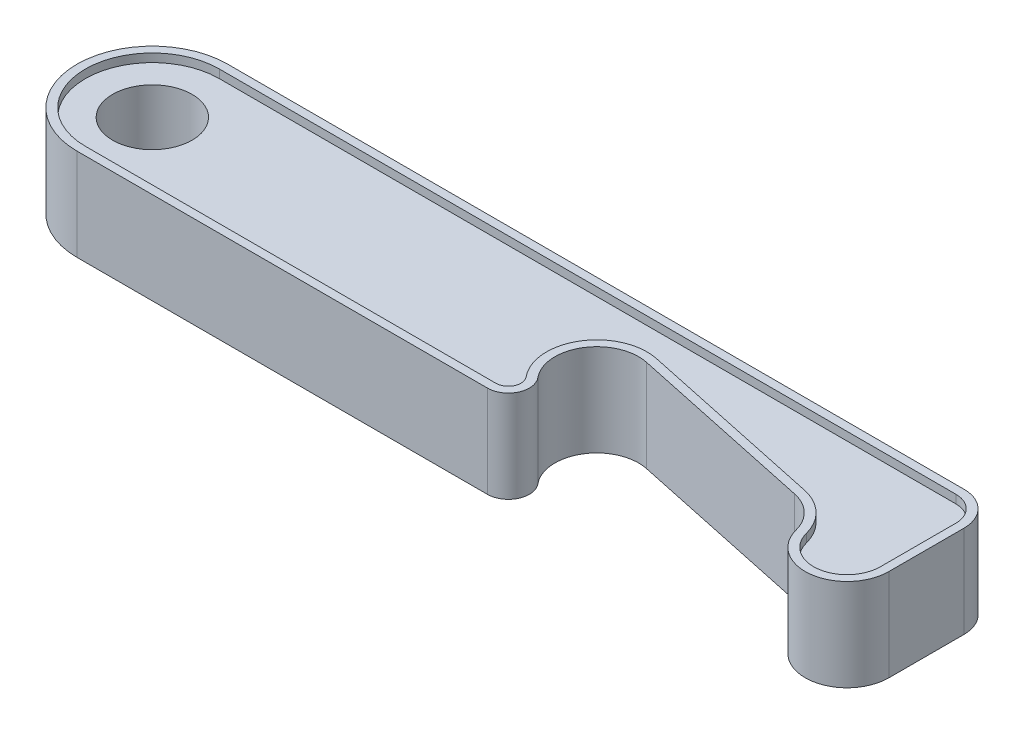
ISO-10303-21;
HEADER;
FILE_DESCRIPTION(('STEP AP214'),'2;1');
FILE_NAME('part.step','',(''),(''),'','','');
FILE_SCHEMA(('AUTOMOTIVE_DESIGN { 1 0 10303 214 1 1 1 1 }'));
ENDSEC;
DATA;
#1=APPLICATION_CONTEXT('core data for automotive mechanical design processes');
#2=APPLICATION_PROTOCOL_DEFINITION('international standard','automotive_design',2000,#1);
#3=PRODUCT_CONTEXT('',#1,'mechanical');
#4=PRODUCT('Part','Part','',(#3));
#5=PRODUCT_RELATED_PRODUCT_CATEGORY('part','',(#4));
#6=PRODUCT_DEFINITION_FORMATION('','',#4);
#7=PRODUCT_DEFINITION_CONTEXT('part definition',#1,'design');
#8=PRODUCT_DEFINITION('design','',#6,#7);
#9=PRODUCT_DEFINITION_SHAPE('','',#8);
#10=(LENGTH_UNIT() NAMED_UNIT(*) SI_UNIT(.MILLI.,.METRE.));
#11=(NAMED_UNIT(*) PLANE_ANGLE_UNIT() SI_UNIT($,.RADIAN.));
#12=(NAMED_UNIT(*) SI_UNIT($,.STERADIAN.) SOLID_ANGLE_UNIT());
#13=UNCERTAINTY_MEASURE_WITH_UNIT(LENGTH_MEASURE(1.E-05),#10,'distance_accuracy_value','');
#14=(GEOMETRIC_REPRESENTATION_CONTEXT(3) GLOBAL_UNCERTAINTY_ASSIGNED_CONTEXT((#13)) GLOBAL_UNIT_ASSIGNED_CONTEXT((#10,
#11,#12)) REPRESENTATION_CONTEXT('',''));
#15=CARTESIAN_POINT('',(0.,0.,0.));
#16=DIRECTION('',(0.,0.,1.));
#17=DIRECTION('',(1.,0.,0.));
#18=AXIS2_PLACEMENT_3D('',#15,#16,#17);
#19=CARTESIAN_POINT('',(0.,-4.5,0.));
#20=DIRECTION('',(0.,1.,0.));
#21=DIRECTION('',(0.,0.,1.));
#22=AXIS2_PLACEMENT_3D('',#19,#20,#21);
#23=CYLINDRICAL_SURFACE('',#22,4.75);
#24=CARTESIAN_POINT('',(0.,-4.5,0.));
#25=DIRECTION('',(0.,1.,0.));
#26=DIRECTION('',(0.,0.,1.));
#27=AXIS2_PLACEMENT_3D('',#24,#25,#26);
#28=CIRCLE('',#27,4.75);
#29=CARTESIAN_POINT('',(0.,-4.5,4.75));
#30=VERTEX_POINT('',#29);
#31=EDGE_CURVE('E451',#30,#30,#28,.T.);
#32=ORIENTED_EDGE('',*,*,#31,.F.);
#33=EDGE_LOOP('',(#32));
#34=FACE_BOUND('',#33,.T.);
#35=CARTESIAN_POINT('',(0.,4.5,0.));
#36=DIRECTION('',(0.,1.,0.));
#37=DIRECTION('',(0.,0.,1.));
#38=AXIS2_PLACEMENT_3D('',#35,#36,#37);
#39=CIRCLE('',#38,4.75);
#40=CARTESIAN_POINT('',(0.,4.5,4.75));
#41=VERTEX_POINT('',#40);
#42=EDGE_CURVE('E372',#41,#41,#39,.T.);
#43=ORIENTED_EDGE('',*,*,#42,.T.);
#44=EDGE_LOOP('',(#43));
#45=FACE_BOUND('',#44,.T.);
#46=ADVANCED_FACE('F39',(#34,#45),#23,.F.);
#47=CARTESIAN_POINT('',(0.,-4.5,0.));
#48=DIRECTION('',(0.,1.,0.));
#49=DIRECTION('',(0.,0.,1.));
#50=AXIS2_PLACEMENT_3D('',#47,#48,#49);
#51=PLANE('',#50);
#52=ORIENTED_EDGE('',*,*,#31,.T.);
#53=EDGE_LOOP('',(#52));
#54=FACE_BOUND('',#53,.T.);
#55=DIRECTION('',(-1.,0.,0.));
#56=VECTOR('',#55,1.);
#57=CARTESIAN_POINT('',(0.,-4.5,-7.99999999999999));
#58=LINE('',#57,#56);
#59=CARTESIAN_POINT('',(88.,-4.5,-7.99999999999999));
#60=VERTEX_POINT('',#59);
#61=CARTESIAN_POINT('',(0.,-4.5,-7.99999999999999));
#62=VERTEX_POINT('',#61);
#63=EDGE_CURVE('E452',#60,#62,#58,.T.);
#64=ORIENTED_EDGE('',*,*,#63,.F.);
#65=CARTESIAN_POINT('',(88.,-4.5,-4.99999999999999));
#66=DIRECTION('',(0.,1.,0.));
#67=DIRECTION('',(0.,0.,1.));
#68=AXIS2_PLACEMENT_3D('',#65,#66,#67);
#69=CIRCLE('',#68,3.);
#70=CARTESIAN_POINT('',(91.,-4.5,-4.99999999999999));
#71=VERTEX_POINT('',#70);
#72=EDGE_CURVE('E11',#60,#71,#69,.F.);
#73=ORIENTED_EDGE('',*,*,#72,.T.);
#74=DIRECTION('',(0.,0.,1.));
#75=VECTOR('',#74,1.);
#76=CARTESIAN_POINT('',(91.,-4.5,0.));
#77=LINE('',#76,#75);
#78=CARTESIAN_POINT('',(91.,-4.5,4.));
#79=VERTEX_POINT('',#78);
#80=EDGE_CURVE('E46',#71,#79,#77,.T.);
#81=ORIENTED_EDGE('',*,*,#80,.T.);
#82=CARTESIAN_POINT('',(87.,-4.5,4.));
#83=DIRECTION('',(0.,1.,0.));
#84=DIRECTION('',(0.,0.,1.));
#85=AXIS2_PLACEMENT_3D('',#82,#83,#84);
#86=CIRCLE('',#85,4.);
#87=CARTESIAN_POINT('',(83.1270166537926,-4.5,5.));
#88=VERTEX_POINT('',#87);
#89=EDGE_CURVE('E471',#79,#88,#86,.F.);
#90=ORIENTED_EDGE('',*,*,#89,.T.);
#91=CARTESIAN_POINT('',(77.3175416344815,-4.5,6.49999999999999));
#92=DIRECTION('',(0.,1.,0.));
#93=DIRECTION('',(0.,0.,1.));
#94=AXIS2_PLACEMENT_3D('',#91,#92,#93);
#95=CIRCLE('',#94,6.);
#96=CARTESIAN_POINT('',(78.565011779388,-4.5,0.631114395597156));
#97=VERTEX_POINT('',#96);
#98=EDGE_CURVE('E469',#88,#97,#95,.T.);
#99=ORIENTED_EDGE('',*,*,#98,.T.);
#100=DIRECTION('',(-0.978147600733806,0.,-0.207911690817759));
#101=VECTOR('',#100,1.);
#102=CARTESIAN_POINT('',(3.26780239401432,-4.5,-15.3738015347056));
#103=LINE('',#102,#101);
#104=CARTESIAN_POINT('',(56.065011779388,-4.5,-4.15140824197834));
#105=VERTEX_POINT('',#104);
#106=EDGE_CURVE('E470',#97,#105,#103,.T.);
#107=ORIENTED_EDGE('',*,*,#106,.T.);
#108=CARTESIAN_POINT('',(54.8175416344815,-4.5,1.7174773624245));
#109=DIRECTION('',(0.,1.,0.));
#110=DIRECTION('',(0.,0.,1.));
#111=AXIS2_PLACEMENT_3D('',#108,#109,#110);
#112=CIRCLE('',#111,6.);
#113=CARTESIAN_POINT('',(50.1956821146031,-4.5,5.54349547248491));
#114=VERTEX_POINT('',#113);
#115=EDGE_CURVE('E461',#105,#114,#112,.T.);
#116=ORIENTED_EDGE('',*,*,#115,.T.);
#117=CARTESIAN_POINT('',(49.0402172346336,-4.5,6.50000000000001));
#118=DIRECTION('',(0.,1.,0.));
#119=DIRECTION('',(0.,0.,1.));
#120=AXIS2_PLACEMENT_3D('',#117,#118,#119);
#121=CIRCLE('',#120,1.5);
#122=CARTESIAN_POINT('',(49.0402172346336,-4.5,8.));
#123=VERTEX_POINT('',#122);
#124=EDGE_CURVE('E462',#114,#123,#121,.F.);
#125=ORIENTED_EDGE('',*,*,#124,.T.);
#126=DIRECTION('',(-1.,0.,0.));
#127=VECTOR('',#126,1.);
#128=CARTESIAN_POINT('',(0.,-4.5,8.));
#129=LINE('',#128,#127);
#130=CARTESIAN_POINT('',(0.,-4.5,8.));
#131=VERTEX_POINT('',#130);
#132=EDGE_CURVE('E457',#123,#131,#129,.T.);
#133=ORIENTED_EDGE('',*,*,#132,.T.);
#134=CARTESIAN_POINT('',(0.,-4.5,0.));
#135=DIRECTION('',(0.,1.,0.));
#136=DIRECTION('',(0.,0.,1.));
#137=AXIS2_PLACEMENT_3D('',#134,#135,#136);
#138=CIRCLE('',#137,8.);
#139=EDGE_CURVE('E456',#62,#131,#138,.T.);
#140=ORIENTED_EDGE('',*,*,#139,.F.);
#141=EDGE_LOOP('',(#64,#73,#81,#90,#99,#107,#116,#125,#133,#140));
#142=FACE_BOUND('',#141,.T.);
#143=ADVANCED_FACE('F476',(#54,#142),#51,.F.);
#144=CARTESIAN_POINT('',(0.,4.5,0.));
#145=DIRECTION('',(0.,1.,0.));
#146=DIRECTION('',(0.,0.,1.));
#147=AXIS2_PLACEMENT_3D('',#144,#145,#146);
#148=PLANE('',#147);
#149=ORIENTED_EDGE('',*,*,#42,.F.);
#150=EDGE_LOOP('',(#149));
#151=FACE_BOUND('',#150,.T.);
#152=DIRECTION('',(-1.,0.,0.));
#153=VECTOR('',#152,1.);
#154=CARTESIAN_POINT('',(0.,4.5,-7.99999999999999));
#155=LINE('',#154,#153);
#156=CARTESIAN_POINT('',(88.,4.5,-7.99999999999999));
#157=VERTEX_POINT('',#156);
#158=CARTESIAN_POINT('',(0.,4.5,-7.99999999999999));
#159=VERTEX_POINT('',#158);
#160=EDGE_CURVE('E427',#157,#159,#155,.T.);
#161=ORIENTED_EDGE('',*,*,#160,.T.);
#162=CARTESIAN_POINT('',(0.,4.5,0.));
#163=DIRECTION('',(0.,1.,0.));
#164=DIRECTION('',(0.,0.,1.));
#165=AXIS2_PLACEMENT_3D('',#162,#163,#164);
#166=CIRCLE('',#165,8.);
#167=CARTESIAN_POINT('',(0.,4.5,8.));
#168=VERTEX_POINT('',#167);
#169=EDGE_CURVE('E243',#159,#168,#166,.T.);
#170=ORIENTED_EDGE('',*,*,#169,.T.);
#171=DIRECTION('',(-1.,0.,0.));
#172=VECTOR('',#171,1.);
#173=CARTESIAN_POINT('',(0.,4.5,8.));
#174=LINE('',#173,#172);
#175=CARTESIAN_POINT('',(49.0402172346336,4.5,8.));
#176=VERTEX_POINT('',#175);
#177=EDGE_CURVE('E429',#176,#168,#174,.T.);
#178=ORIENTED_EDGE('',*,*,#177,.F.);
#179=CARTESIAN_POINT('',(49.0402172346336,4.5,6.50000000000001));
#180=DIRECTION('',(0.,1.,0.));
#181=DIRECTION('',(0.,0.,1.));
#182=AXIS2_PLACEMENT_3D('',#179,#180,#181);
#183=CIRCLE('',#182,1.5);
#184=CARTESIAN_POINT('',(50.1956821146031,4.5,5.54349547248491));
#185=VERTEX_POINT('',#184);
#186=EDGE_CURVE('E435',#185,#176,#183,.F.);
#187=ORIENTED_EDGE('',*,*,#186,.F.);
#188=CARTESIAN_POINT('',(54.8175416344815,4.5,1.7174773624245));
#189=DIRECTION('',(0.,1.,0.));
#190=DIRECTION('',(0.,0.,1.));
#191=AXIS2_PLACEMENT_3D('',#188,#189,#190);
#192=CIRCLE('',#191,6.);
#193=CARTESIAN_POINT('',(56.065011779388,4.5,-4.15140824197834));
#194=VERTEX_POINT('',#193);
#195=EDGE_CURVE('E434',#194,#185,#192,.T.);
#196=ORIENTED_EDGE('',*,*,#195,.F.);
#197=DIRECTION('',(-0.978147600733806,0.,-0.207911690817759));
#198=VECTOR('',#197,1.);
#199=CARTESIAN_POINT('',(3.26780239401432,4.5,-15.3738015347056));
#200=LINE('',#199,#198);
#201=CARTESIAN_POINT('',(78.565011779388,4.5,0.631114395597156));
#202=VERTEX_POINT('',#201);
#203=EDGE_CURVE('E436',#202,#194,#200,.T.);
#204=ORIENTED_EDGE('',*,*,#203,.F.);
#205=CARTESIAN_POINT('',(77.3175416344815,4.5,6.49999999999999));
#206=DIRECTION('',(0.,1.,0.));
#207=DIRECTION('',(0.,0.,1.));
#208=AXIS2_PLACEMENT_3D('',#205,#206,#207);
#209=CIRCLE('',#208,6.);
#210=CARTESIAN_POINT('',(83.1270166537926,4.5,5.));
#211=VERTEX_POINT('',#210);
#212=EDGE_CURVE('E443',#211,#202,#209,.T.);
#213=ORIENTED_EDGE('',*,*,#212,.F.);
#214=CARTESIAN_POINT('',(87.,4.5,4.));
#215=DIRECTION('',(0.,1.,0.));
#216=DIRECTION('',(0.,0.,1.));
#217=AXIS2_PLACEMENT_3D('',#214,#215,#216);
#218=CIRCLE('',#217,4.);
#219=CARTESIAN_POINT('',(91.,4.5,4.));
#220=VERTEX_POINT('',#219);
#221=EDGE_CURVE('E444',#220,#211,#218,.F.);
#222=ORIENTED_EDGE('',*,*,#221,.F.);
#223=DIRECTION('',(0.,0.,1.));
#224=VECTOR('',#223,1.);
#225=CARTESIAN_POINT('',(91.,4.5,0.));
#226=LINE('',#225,#224);
#227=CARTESIAN_POINT('',(91.,4.5,-4.99999999999999));
#228=VERTEX_POINT('',#227);
#229=EDGE_CURVE('E450',#228,#220,#226,.T.);
#230=ORIENTED_EDGE('',*,*,#229,.F.);
#231=CARTESIAN_POINT('',(88.,4.5,-4.99999999999999));
#232=DIRECTION('',(0.,1.,0.));
#233=DIRECTION('',(0.,0.,1.));
#234=AXIS2_PLACEMENT_3D('',#231,#232,#233);
#235=CIRCLE('',#234,3.);
#236=EDGE_CURVE('E63',#157,#228,#235,.F.);
#237=ORIENTED_EDGE('',*,*,#236,.F.);
#238=EDGE_LOOP('',(#161,#170,#178,#187,#196,#204,#213,#222,#230,#237));
#239=FACE_BOUND('',#238,.T.);
#240=ADVANCED_FACE('F514',(#151,#239),#148,.T.);
#241=CARTESIAN_POINT('',(0.,-5.5,-7.99999999999999));
#242=DIRECTION('',(0.,0.,-1.));
#243=DIRECTION('',(-1.,0.,0.));
#244=AXIS2_PLACEMENT_3D('',#241,#242,#243);
#245=PLANE('',#244);
#246=DIRECTION('',(0.,1.,0.));
#247=VECTOR('',#246,1.);
#248=CARTESIAN_POINT('',(88.,-5.5,-7.99999999999999));
#249=LINE('',#248,#247);
#250=CARTESIAN_POINT('',(88.,-5.5,-7.99999999999999));
#251=VERTEX_POINT('',#250);
#252=EDGE_CURVE('E418',#251,#60,#249,.T.);
#253=ORIENTED_EDGE('',*,*,#252,.T.);
#254=ORIENTED_EDGE('',*,*,#63,.T.);
#255=DIRECTION('',(0.,1.,0.));
#256=VECTOR('',#255,1.);
#257=CARTESIAN_POINT('',(0.,-5.5,-7.99999999999999));
#258=LINE('',#257,#256);
#259=CARTESIAN_POINT('',(0.,-5.5,-7.99999999999999));
#260=VERTEX_POINT('',#259);
#261=EDGE_CURVE('E242',#260,#62,#258,.T.);
#262=ORIENTED_EDGE('',*,*,#261,.F.);
#263=DIRECTION('',(-1.,0.,0.));
#264=VECTOR('',#263,1.);
#265=CARTESIAN_POINT('',(0.,-5.5,-7.99999999999999));
#266=LINE('',#265,#264);
#267=EDGE_CURVE('E316',#251,#260,#266,.T.);
#268=ORIENTED_EDGE('',*,*,#267,.F.);
#269=EDGE_LOOP('',(#253,#254,#262,#268));
#270=FACE_BOUND('',#269,.T.);
#271=ADVANCED_FACE('F511',(#270),#245,.F.);
#272=CARTESIAN_POINT('',(91.,-5.5,0.));
#273=DIRECTION('',(-1.,0.,0.));
#274=DIRECTION('',(0.,0.,1.));
#275=AXIS2_PLACEMENT_3D('',#272,#273,#274);
#276=PLANE('',#275);
#277=ORIENTED_EDGE('',*,*,#80,.F.);
#278=DIRECTION('',(0.,1.,0.));
#279=VECTOR('',#278,1.);
#280=CARTESIAN_POINT('',(91.,-5.5,-4.99999999999999));
#281=LINE('',#280,#279);
#282=CARTESIAN_POINT('',(91.,-5.5,-4.99999999999999));
#283=VERTEX_POINT('',#282);
#284=EDGE_CURVE('E417',#283,#71,#281,.T.);
#285=ORIENTED_EDGE('',*,*,#284,.F.);
#286=DIRECTION('',(0.,0.,1.));
#287=VECTOR('',#286,1.);
#288=CARTESIAN_POINT('',(91.,-5.5,0.));
#289=LINE('',#288,#287);
#290=CARTESIAN_POINT('',(91.,-5.5,4.));
#291=VERTEX_POINT('',#290);
#292=EDGE_CURVE('E321',#283,#291,#289,.T.);
#293=ORIENTED_EDGE('',*,*,#292,.T.);
#294=DIRECTION('',(0.,1.,0.));
#295=VECTOR('',#294,1.);
#296=CARTESIAN_POINT('',(91.,-5.5,4.));
#297=LINE('',#296,#295);
#298=EDGE_CURVE('E415',#291,#79,#297,.T.);
#299=ORIENTED_EDGE('',*,*,#298,.T.);
#300=EDGE_LOOP('',(#277,#285,#293,#299));
#301=FACE_BOUND('',#300,.T.);
#302=ADVANCED_FACE('F479',(#301),#276,.T.);
#303=CARTESIAN_POINT('',(0.,-5.5,8.));
#304=DIRECTION('',(0.,0.,-1.));
#305=DIRECTION('',(-1.,0.,0.));
#306=AXIS2_PLACEMENT_3D('',#303,#304,#305);
#307=PLANE('',#306);
#308=ORIENTED_EDGE('',*,*,#132,.F.);
#309=DIRECTION('',(0.,1.,0.));
#310=VECTOR('',#309,1.);
#311=CARTESIAN_POINT('',(49.0402172346336,-5.5,8.));
#312=LINE('',#311,#310);
#313=CARTESIAN_POINT('',(49.0402172346336,-5.5,8.));
#314=VERTEX_POINT('',#313);
#315=EDGE_CURVE('E395',#314,#123,#312,.T.);
#316=ORIENTED_EDGE('',*,*,#315,.F.);
#317=DIRECTION('',(-1.,0.,0.));
#318=VECTOR('',#317,1.);
#319=CARTESIAN_POINT('',(0.,-5.5,8.));
#320=LINE('',#319,#318);
#321=CARTESIAN_POINT('',(0.,-5.5,8.));
#322=VERTEX_POINT('',#321);
#323=EDGE_CURVE('E336',#314,#322,#320,.T.);
#324=ORIENTED_EDGE('',*,*,#323,.T.);
#325=DIRECTION('',(0.,1.,0.));
#326=VECTOR('',#325,1.);
#327=CARTESIAN_POINT('',(0.,-5.5,8.));
#328=LINE('',#327,#326);
#329=EDGE_CURVE('E389',#322,#131,#328,.T.);
#330=ORIENTED_EDGE('',*,*,#329,.T.);
#331=EDGE_LOOP('',(#308,#316,#324,#330));
#332=FACE_BOUND('',#331,.T.);
#333=ADVANCED_FACE('F510',(#332),#307,.T.);
#334=CARTESIAN_POINT('',(0.,-5.5,0.));
#335=DIRECTION('',(0.,1.,0.));
#336=DIRECTION('',(0.,0.,1.));
#337=AXIS2_PLACEMENT_3D('',#334,#335,#336);
#338=CYLINDRICAL_SURFACE('',#337,8.);
#339=ORIENTED_EDGE('',*,*,#261,.T.);
#340=ORIENTED_EDGE('',*,*,#139,.T.);
#341=ORIENTED_EDGE('',*,*,#329,.F.);
#342=CARTESIAN_POINT('',(0.,-5.5,0.));
#343=DIRECTION('',(0.,1.,0.));
#344=DIRECTION('',(0.,0.,1.));
#345=AXIS2_PLACEMENT_3D('',#342,#343,#344);
#346=CIRCLE('',#345,8.);
#347=EDGE_CURVE('E312',#260,#322,#346,.T.);
#348=ORIENTED_EDGE('',*,*,#347,.F.);
#349=EDGE_LOOP('',(#339,#340,#341,#348));
#350=FACE_BOUND('',#349,.T.);
#351=ADVANCED_FACE('F513',(#350),#338,.F.);
#352=CARTESIAN_POINT('',(49.0402172346336,-5.5,6.50000000000001));
#353=DIRECTION('',(0.,1.,0.));
#354=DIRECTION('',(0.,0.,1.));
#355=AXIS2_PLACEMENT_3D('',#352,#353,#354);
#356=CYLINDRICAL_SURFACE('',#355,1.5);
#357=ORIENTED_EDGE('',*,*,#124,.F.);
#358=DIRECTION('',(0.,1.,0.));
#359=VECTOR('',#358,1.);
#360=CARTESIAN_POINT('',(50.1956821146031,-5.5,5.54349547248491));
#361=LINE('',#360,#359);
#362=CARTESIAN_POINT('',(50.1956821146031,-5.5,5.54349547248491));
#363=VERTEX_POINT('',#362);
#364=EDGE_CURVE('E396',#363,#114,#361,.T.);
#365=ORIENTED_EDGE('',*,*,#364,.F.);
#366=CARTESIAN_POINT('',(49.0402172346336,-5.5,6.50000000000001));
#367=DIRECTION('',(0.,1.,0.));
#368=DIRECTION('',(0.,0.,1.));
#369=AXIS2_PLACEMENT_3D('',#366,#367,#368);
#370=CIRCLE('',#369,1.5);
#371=EDGE_CURVE('E334',#363,#314,#370,.F.);
#372=ORIENTED_EDGE('',*,*,#371,.T.);
#373=ORIENTED_EDGE('',*,*,#315,.T.);
#374=EDGE_LOOP('',(#357,#365,#372,#373));
#375=FACE_BOUND('',#374,.T.);
#376=ADVANCED_FACE('F503',(#375),#356,.F.);
#377=CARTESIAN_POINT('',(54.8175416344815,-5.5,1.7174773624245));
#378=DIRECTION('',(0.,1.,0.));
#379=DIRECTION('',(0.,0.,1.));
#380=AXIS2_PLACEMENT_3D('',#377,#378,#379);
#381=CYLINDRICAL_SURFACE('',#380,6.);
#382=ORIENTED_EDGE('',*,*,#115,.F.);
#383=DIRECTION('',(0.,1.,0.));
#384=VECTOR('',#383,1.);
#385=CARTESIAN_POINT('',(56.065011779388,-5.5,-4.15140824197834));
#386=LINE('',#385,#384);
#387=CARTESIAN_POINT('',(56.065011779388,-5.5,-4.15140824197834));
#388=VERTEX_POINT('',#387);
#389=EDGE_CURVE('E405',#388,#105,#386,.T.);
#390=ORIENTED_EDGE('',*,*,#389,.F.);
#391=CARTESIAN_POINT('',(54.8175416344815,-5.5,1.7174773624245));
#392=DIRECTION('',(0.,1.,0.));
#393=DIRECTION('',(0.,0.,1.));
#394=AXIS2_PLACEMENT_3D('',#391,#392,#393);
#395=CIRCLE('',#394,6.);
#396=EDGE_CURVE('E335',#388,#363,#395,.T.);
#397=ORIENTED_EDGE('',*,*,#396,.T.);
#398=ORIENTED_EDGE('',*,*,#364,.T.);
#399=EDGE_LOOP('',(#382,#390,#397,#398));
#400=FACE_BOUND('',#399,.T.);
#401=ADVANCED_FACE('F499',(#400),#381,.T.);
#402=CARTESIAN_POINT('',(3.26780239401432,-5.5,-15.3738015347056));
#403=DIRECTION('',(0.207911690817759,0.,-0.978147600733806));
#404=DIRECTION('',(-0.978147600733806,0.,-0.207911690817759));
#405=AXIS2_PLACEMENT_3D('',#402,#403,#404);
#406=PLANE('',#405);
#407=ORIENTED_EDGE('',*,*,#106,.F.);
#408=DIRECTION('',(0.,1.,0.));
#409=VECTOR('',#408,1.);
#410=CARTESIAN_POINT('',(78.565011779388,-5.5,0.631114395597156));
#411=LINE('',#410,#409);
#412=CARTESIAN_POINT('',(78.565011779388,-5.5,0.631114395597156));
#413=VERTEX_POINT('',#412);
#414=EDGE_CURVE('E52',#413,#97,#411,.T.);
#415=ORIENTED_EDGE('',*,*,#414,.F.);
#416=DIRECTION('',(-0.978147600733806,0.,-0.207911690817759));
#417=VECTOR('',#416,1.);
#418=CARTESIAN_POINT('',(3.26780239401432,-5.5,-15.3738015347056));
#419=LINE('',#418,#417);
#420=EDGE_CURVE('E326',#413,#388,#419,.T.);
#421=ORIENTED_EDGE('',*,*,#420,.T.);
#422=ORIENTED_EDGE('',*,*,#389,.T.);
#423=EDGE_LOOP('',(#407,#415,#421,#422));
#424=FACE_BOUND('',#423,.T.);
#425=ADVANCED_FACE('F500',(#424),#406,.T.);
#426=CARTESIAN_POINT('',(77.3175416344815,-5.5,6.49999999999999));
#427=DIRECTION('',(0.,1.,0.));
#428=DIRECTION('',(0.,0.,1.));
#429=AXIS2_PLACEMENT_3D('',#426,#427,#428);
#430=CYLINDRICAL_SURFACE('',#429,6.);
#431=ORIENTED_EDGE('',*,*,#98,.F.);
#432=DIRECTION('',(0.,1.,0.));
#433=VECTOR('',#432,1.);
#434=CARTESIAN_POINT('',(83.1270166537926,-5.5,5.));
#435=LINE('',#434,#433);
#436=CARTESIAN_POINT('',(83.1270166537926,-5.5,5.));
#437=VERTEX_POINT('',#436);
#438=EDGE_CURVE('E408',#437,#88,#435,.T.);
#439=ORIENTED_EDGE('',*,*,#438,.F.);
#440=CARTESIAN_POINT('',(77.3175416344815,-5.5,6.49999999999999));
#441=DIRECTION('',(0.,1.,0.));
#442=DIRECTION('',(0.,0.,1.));
#443=AXIS2_PLACEMENT_3D('',#440,#441,#442);
#444=CIRCLE('',#443,6.);
#445=EDGE_CURVE('E330',#437,#413,#444,.T.);
#446=ORIENTED_EDGE('',*,*,#445,.T.);
#447=ORIENTED_EDGE('',*,*,#414,.T.);
#448=EDGE_LOOP('',(#431,#439,#446,#447));
#449=FACE_BOUND('',#448,.T.);
#450=ADVANCED_FACE('F494',(#449),#430,.T.);
#451=CARTESIAN_POINT('',(87.,-5.5,4.));
#452=DIRECTION('',(0.,1.,0.));
#453=DIRECTION('',(0.,0.,1.));
#454=AXIS2_PLACEMENT_3D('',#451,#452,#453);
#455=CYLINDRICAL_SURFACE('',#454,4.);
#456=ORIENTED_EDGE('',*,*,#89,.F.);
#457=ORIENTED_EDGE('',*,*,#298,.F.);
#458=CARTESIAN_POINT('',(87.,-5.5,4.));
#459=DIRECTION('',(0.,1.,0.));
#460=DIRECTION('',(0.,0.,1.));
#461=AXIS2_PLACEMENT_3D('',#458,#459,#460);
#462=CIRCLE('',#461,4.);
#463=EDGE_CURVE('E323',#291,#437,#462,.F.);
#464=ORIENTED_EDGE('',*,*,#463,.T.);
#465=ORIENTED_EDGE('',*,*,#438,.T.);
#466=EDGE_LOOP('',(#456,#457,#464,#465));
#467=FACE_BOUND('',#466,.T.);
#468=ADVANCED_FACE('F492',(#467),#455,.F.);
#469=CARTESIAN_POINT('',(88.,-5.5,-4.99999999999999));
#470=DIRECTION('',(0.,1.,0.));
#471=DIRECTION('',(0.,0.,1.));
#472=AXIS2_PLACEMENT_3D('',#469,#470,#471);
#473=CYLINDRICAL_SURFACE('',#472,3.);
#474=ORIENTED_EDGE('',*,*,#72,.F.);
#475=ORIENTED_EDGE('',*,*,#252,.F.);
#476=CARTESIAN_POINT('',(88.,-5.5,-4.99999999999999));
#477=DIRECTION('',(0.,1.,0.));
#478=DIRECTION('',(0.,0.,1.));
#479=AXIS2_PLACEMENT_3D('',#476,#477,#478);
#480=CIRCLE('',#479,3.);
#481=EDGE_CURVE('E318',#251,#283,#480,.F.);
#482=ORIENTED_EDGE('',*,*,#481,.T.);
#483=ORIENTED_EDGE('',*,*,#284,.T.);
#484=EDGE_LOOP('',(#474,#475,#482,#483));
#485=FACE_BOUND('',#484,.T.);
#486=ADVANCED_FACE('F481',(#485),#473,.F.);
#487=CARTESIAN_POINT('',(0.,-5.5,-8.99999999999999));
#488=DIRECTION('',(0.,0.,-1.));
#489=DIRECTION('',(-1.,0.,0.));
#490=AXIS2_PLACEMENT_3D('',#487,#488,#489);
#491=PLANE('',#490);
#492=DIRECTION('',(0.,1.,0.));
#493=VECTOR('',#492,1.);
#494=CARTESIAN_POINT('',(0.,-5.5,-8.99999999999999));
#495=LINE('',#494,#493);
#496=CARTESIAN_POINT('',(0.,-5.5,-8.99999999999999));
#497=VERTEX_POINT('',#496);
#498=CARTESIAN_POINT('',(0.,5.5,-8.99999999999999));
#499=VERTEX_POINT('',#498);
#500=EDGE_CURVE('E386',#497,#499,#495,.T.);
#501=ORIENTED_EDGE('',*,*,#500,.T.);
#502=DIRECTION('',(-1.,0.,0.));
#503=VECTOR('',#502,1.);
#504=CARTESIAN_POINT('',(0.,5.5,-8.99999999999999));
#505=LINE('',#504,#503);
#506=CARTESIAN_POINT('',(88.,5.5,-8.99999999999999));
#507=VERTEX_POINT('',#506);
#508=EDGE_CURVE('E281',#507,#499,#505,.T.);
#509=ORIENTED_EDGE('',*,*,#508,.F.);
#510=DIRECTION('',(0.,1.,0.));
#511=VECTOR('',#510,1.);
#512=CARTESIAN_POINT('',(88.,-5.5,-8.99999999999999));
#513=LINE('',#512,#511);
#514=CARTESIAN_POINT('',(88.,-5.5,-8.99999999999999));
#515=VERTEX_POINT('',#514);
#516=EDGE_CURVE('E368',#515,#507,#513,.T.);
#517=ORIENTED_EDGE('',*,*,#516,.F.);
#518=DIRECTION('',(-1.,0.,0.));
#519=VECTOR('',#518,1.);
#520=CARTESIAN_POINT('',(0.,-5.5,-8.99999999999999));
#521=LINE('',#520,#519);
#522=EDGE_CURVE('E343',#515,#497,#521,.T.);
#523=ORIENTED_EDGE('',*,*,#522,.T.);
#524=EDGE_LOOP('',(#501,#509,#517,#523));
#525=FACE_BOUND('',#524,.T.);
#526=ADVANCED_FACE('F599',(#525),#491,.T.);
#527=CARTESIAN_POINT('',(88.,-5.5,-4.99999999999999));
#528=DIRECTION('',(0.,1.,0.));
#529=DIRECTION('',(0.,0.,1.));
#530=AXIS2_PLACEMENT_3D('',#527,#528,#529);
#531=CYLINDRICAL_SURFACE('',#530,4.);
#532=ORIENTED_EDGE('',*,*,#516,.T.);
#533=CARTESIAN_POINT('',(88.,5.5,-4.99999999999999));
#534=DIRECTION('',(0.,1.,0.));
#535=DIRECTION('',(0.,0.,1.));
#536=AXIS2_PLACEMENT_3D('',#533,#534,#535);
#537=CIRCLE('',#536,4.);
#538=CARTESIAN_POINT('',(92.,5.5,-4.99999999999999));
#539=VERTEX_POINT('',#538);
#540=EDGE_CURVE('E311',#507,#539,#537,.F.);
#541=ORIENTED_EDGE('',*,*,#540,.T.);
#542=DIRECTION('',(0.,1.,0.));
#543=VECTOR('',#542,1.);
#544=CARTESIAN_POINT('',(92.,-5.5,-4.99999999999999));
#545=LINE('',#544,#543);
#546=CARTESIAN_POINT('',(92.,-5.5,-4.99999999999999));
#547=VERTEX_POINT('',#546);
#548=EDGE_CURVE('E375',#547,#539,#545,.T.);
#549=ORIENTED_EDGE('',*,*,#548,.F.);
#550=CARTESIAN_POINT('',(88.,-5.5,-4.99999999999999));
#551=DIRECTION('',(0.,1.,0.));
#552=DIRECTION('',(0.,0.,1.));
#553=AXIS2_PLACEMENT_3D('',#550,#551,#552);
#554=CIRCLE('',#553,4.);
#555=EDGE_CURVE('E244',#515,#547,#554,.F.);
#556=ORIENTED_EDGE('',*,*,#555,.F.);
#557=EDGE_LOOP('',(#532,#541,#549,#556));
#558=FACE_BOUND('',#557,.T.);
#559=ADVANCED_FACE('F601',(#558),#531,.T.);
#560=CARTESIAN_POINT('',(92.,-5.5,0.));
#561=DIRECTION('',(-1.,0.,0.));
#562=DIRECTION('',(0.,0.,1.));
#563=AXIS2_PLACEMENT_3D('',#560,#561,#562);
#564=PLANE('',#563);
#565=ORIENTED_EDGE('',*,*,#548,.T.);
#566=DIRECTION('',(0.,0.,1.));
#567=VECTOR('',#566,1.);
#568=CARTESIAN_POINT('',(92.,5.5,0.));
#569=LINE('',#568,#567);
#570=CARTESIAN_POINT('',(92.,5.5,4.));
#571=VERTEX_POINT('',#570);
#572=EDGE_CURVE('E306',#539,#571,#569,.T.);
#573=ORIENTED_EDGE('',*,*,#572,.T.);
#574=DIRECTION('',(0.,1.,0.));
#575=VECTOR('',#574,1.);
#576=CARTESIAN_POINT('',(92.,-5.5,4.));
#577=LINE('',#576,#575);
#578=CARTESIAN_POINT('',(92.,-5.5,4.));
#579=VERTEX_POINT('',#578);
#580=EDGE_CURVE('E371',#579,#571,#577,.T.);
#581=ORIENTED_EDGE('',*,*,#580,.F.);
#582=DIRECTION('',(0.,0.,1.));
#583=VECTOR('',#582,1.);
#584=CARTESIAN_POINT('',(92.,-5.5,0.));
#585=LINE('',#584,#583);
#586=EDGE_CURVE('E362',#547,#579,#585,.T.);
#587=ORIENTED_EDGE('',*,*,#586,.F.);
#588=EDGE_LOOP('',(#565,#573,#581,#587));
#589=FACE_BOUND('',#588,.T.);
#590=ADVANCED_FACE('F694',(#589),#564,.F.);
#591=CARTESIAN_POINT('',(87.,-5.5,4.));
#592=DIRECTION('',(0.,1.,0.));
#593=DIRECTION('',(0.,0.,1.));
#594=AXIS2_PLACEMENT_3D('',#591,#592,#593);
#595=CYLINDRICAL_SURFACE('',#594,5.);
#596=ORIENTED_EDGE('',*,*,#580,.T.);
#597=CARTESIAN_POINT('',(87.,5.5,4.));
#598=DIRECTION('',(0.,1.,0.));
#599=DIRECTION('',(0.,0.,1.));
#600=AXIS2_PLACEMENT_3D('',#597,#598,#599);
#601=CIRCLE('',#600,5.);
#602=CARTESIAN_POINT('',(82.1587708172407,5.5,5.25));
#603=VERTEX_POINT('',#602);
#604=EDGE_CURVE('E304',#571,#603,#601,.F.);
#605=ORIENTED_EDGE('',*,*,#604,.T.);
#606=DIRECTION('',(0.,1.,0.));
#607=VECTOR('',#606,1.);
#608=CARTESIAN_POINT('',(82.1587708172407,-5.5,5.25));
#609=LINE('',#608,#607);
#610=CARTESIAN_POINT('',(82.1587708172407,-5.5,5.25));
#611=VERTEX_POINT('',#610);
#612=EDGE_CURVE('E378',#611,#603,#609,.T.);
#613=ORIENTED_EDGE('',*,*,#612,.F.);
#614=CARTESIAN_POINT('',(87.,-5.5,4.));
#615=DIRECTION('',(0.,1.,0.));
#616=DIRECTION('',(0.,0.,1.));
#617=AXIS2_PLACEMENT_3D('',#614,#615,#616);
#618=CIRCLE('',#617,5.);
#619=EDGE_CURVE('E361',#579,#611,#618,.F.);
#620=ORIENTED_EDGE('',*,*,#619,.F.);
#621=EDGE_LOOP('',(#596,#605,#613,#620));
#622=FACE_BOUND('',#621,.T.);
#623=ADVANCED_FACE('F702',(#622),#595,.T.);
#624=CARTESIAN_POINT('',(77.3175416344815,-5.5,6.49999999999999));
#625=DIRECTION('',(0.,1.,0.));
#626=DIRECTION('',(0.,0.,1.));
#627=AXIS2_PLACEMENT_3D('',#624,#625,#626);
#628=CYLINDRICAL_SURFACE('',#627,5.);
#629=ORIENTED_EDGE('',*,*,#612,.T.);
#630=CARTESIAN_POINT('',(77.3175416344815,5.5,6.49999999999999));
#631=DIRECTION('',(0.,1.,0.));
#632=DIRECTION('',(0.,0.,1.));
#633=AXIS2_PLACEMENT_3D('',#630,#631,#632);
#634=CIRCLE('',#633,5.);
#635=CARTESIAN_POINT('',(78.3571000885703,5.5,1.60926199633096));
#636=VERTEX_POINT('',#635);
#637=EDGE_CURVE('E302',#603,#636,#634,.T.);
#638=ORIENTED_EDGE('',*,*,#637,.T.);
#639=DIRECTION('',(0.,1.,0.));
#640=VECTOR('',#639,1.);
#641=CARTESIAN_POINT('',(78.3571000885703,-5.5,1.60926199633096));
#642=LINE('',#641,#640);
#643=CARTESIAN_POINT('',(78.3571000885703,-5.5,1.60926199633096));
#644=VERTEX_POINT('',#643);
#645=EDGE_CURVE('E376',#644,#636,#642,.T.);
#646=ORIENTED_EDGE('',*,*,#645,.F.);
#647=CARTESIAN_POINT('',(77.3175416344815,-5.5,6.49999999999999));
#648=DIRECTION('',(0.,1.,0.));
#649=DIRECTION('',(0.,0.,1.));
#650=AXIS2_PLACEMENT_3D('',#647,#648,#649);
#651=CIRCLE('',#650,5.);
#652=EDGE_CURVE('E358',#611,#644,#651,.T.);
#653=ORIENTED_EDGE('',*,*,#652,.F.);
#654=EDGE_LOOP('',(#629,#638,#646,#653));
#655=FACE_BOUND('',#654,.T.);
#656=ADVANCED_FACE('F711',(#655),#628,.F.);
#657=CARTESIAN_POINT('',(3.05989070319656,-5.5,-14.3956539339718));
#658=DIRECTION('',(0.207911690817759,0.,-0.978147600733806));
#659=DIRECTION('',(-0.978147600733806,0.,-0.207911690817759));
#660=AXIS2_PLACEMENT_3D('',#657,#658,#659);
#661=PLANE('',#660);
#662=ORIENTED_EDGE('',*,*,#645,.T.);
#663=DIRECTION('',(-0.978147600733806,0.,-0.207911690817759));
#664=VECTOR('',#663,1.);
#665=CARTESIAN_POINT('',(3.05989070319656,5.5,-14.3956539339718));
#666=LINE('',#665,#664);
#667=CARTESIAN_POINT('',(55.8571000885702,5.5,-3.17326064124453));
#668=VERTEX_POINT('',#667);
#669=EDGE_CURVE('E297',#636,#668,#666,.T.);
#670=ORIENTED_EDGE('',*,*,#669,.T.);
#671=DIRECTION('',(0.,1.,0.));
#672=VECTOR('',#671,1.);
#673=CARTESIAN_POINT('',(55.8571000885702,-5.5,-3.17326064124453));
#674=LINE('',#673,#672);
#675=CARTESIAN_POINT('',(55.8571000885702,-5.5,-3.17326064124453));
#676=VERTEX_POINT('',#675);
#677=EDGE_CURVE('E379',#676,#668,#674,.T.);
#678=ORIENTED_EDGE('',*,*,#677,.F.);
#679=DIRECTION('',(-0.978147600733806,0.,-0.207911690817759));
#680=VECTOR('',#679,1.);
#681=CARTESIAN_POINT('',(3.05989070319656,-5.5,-14.3956539339718));
#682=LINE('',#681,#680);
#683=EDGE_CURVE('E352',#644,#676,#682,.T.);
#684=ORIENTED_EDGE('',*,*,#683,.F.);
#685=EDGE_LOOP('',(#662,#670,#678,#684));
#686=FACE_BOUND('',#685,.T.);
#687=ADVANCED_FACE('F725',(#686),#661,.F.);
#688=CARTESIAN_POINT('',(54.8175416344815,-5.5,1.7174773624245));
#689=DIRECTION('',(0.,1.,0.));
#690=DIRECTION('',(0.,0.,1.));
#691=AXIS2_PLACEMENT_3D('',#688,#689,#690);
#692=CYLINDRICAL_SURFACE('',#691,5.);
#693=ORIENTED_EDGE('',*,*,#677,.T.);
#694=CARTESIAN_POINT('',(54.8175416344815,5.5,1.7174773624245));
#695=DIRECTION('',(0.,1.,0.));
#696=DIRECTION('',(0.,0.,1.));
#697=AXIS2_PLACEMENT_3D('',#694,#695,#696);
#698=CIRCLE('',#697,5.);
#699=CARTESIAN_POINT('',(50.9659920345829,5.5,4.90582578747483));
#700=VERTEX_POINT('',#699);
#701=EDGE_CURVE('E298',#668,#700,#698,.T.);
#702=ORIENTED_EDGE('',*,*,#701,.T.);
#703=DIRECTION('',(0.,1.,0.));
#704=VECTOR('',#703,1.);
#705=CARTESIAN_POINT('',(50.9659920345829,-5.5,4.90582578747483));
#706=LINE('',#705,#704);
#707=CARTESIAN_POINT('',(50.9659920345829,-5.5,4.90582578747483));
#708=VERTEX_POINT('',#707);
#709=EDGE_CURVE('E385',#708,#700,#706,.T.);
#710=ORIENTED_EDGE('',*,*,#709,.F.);
#711=CARTESIAN_POINT('',(54.8175416344815,-5.5,1.7174773624245));
#712=DIRECTION('',(0.,1.,0.));
#713=DIRECTION('',(0.,0.,1.));
#714=AXIS2_PLACEMENT_3D('',#711,#712,#713);
#715=CIRCLE('',#714,5.);
#716=EDGE_CURVE('E355',#676,#708,#715,.T.);
#717=ORIENTED_EDGE('',*,*,#716,.F.);
#718=EDGE_LOOP('',(#693,#702,#710,#717));
#719=FACE_BOUND('',#718,.T.);
#720=ADVANCED_FACE('F732',(#719),#692,.F.);
#721=CARTESIAN_POINT('',(49.0402172346336,-5.5,6.50000000000001));
#722=DIRECTION('',(0.,1.,0.));
#723=DIRECTION('',(0.,0.,1.));
#724=AXIS2_PLACEMENT_3D('',#721,#722,#723);
#725=CYLINDRICAL_SURFACE('',#724,2.5);
#726=ORIENTED_EDGE('',*,*,#709,.T.);
#727=CARTESIAN_POINT('',(49.0402172346336,5.5,6.50000000000001));
#728=DIRECTION('',(0.,1.,0.));
#729=DIRECTION('',(0.,0.,1.));
#730=AXIS2_PLACEMENT_3D('',#727,#728,#729);
#731=CIRCLE('',#730,2.5);
#732=CARTESIAN_POINT('',(49.0402172346336,5.5,9.00000000000001));
#733=VERTEX_POINT('',#732);
#734=EDGE_CURVE('E291',#700,#733,#731,.F.);
#735=ORIENTED_EDGE('',*,*,#734,.T.);
#736=DIRECTION('',(0.,1.,0.));
#737=VECTOR('',#736,1.);
#738=CARTESIAN_POINT('',(49.0402172346336,-5.5,9.00000000000001));
#739=LINE('',#738,#737);
#740=CARTESIAN_POINT('',(49.0402172346336,-5.5,9.00000000000001));
#741=VERTEX_POINT('',#740);
#742=EDGE_CURVE('E384',#741,#733,#739,.T.);
#743=ORIENTED_EDGE('',*,*,#742,.F.);
#744=CARTESIAN_POINT('',(49.0402172346336,-5.5,6.50000000000001));
#745=DIRECTION('',(0.,1.,0.));
#746=DIRECTION('',(0.,0.,1.));
#747=AXIS2_PLACEMENT_3D('',#744,#745,#746);
#748=CIRCLE('',#747,2.5);
#749=EDGE_CURVE('E350',#708,#741,#748,.F.);
#750=ORIENTED_EDGE('',*,*,#749,.F.);
#751=EDGE_LOOP('',(#726,#735,#743,#750));
#752=FACE_BOUND('',#751,.T.);
#753=ADVANCED_FACE('F739',(#752),#725,.T.);
#754=CARTESIAN_POINT('',(0.,-5.5,9.00000000000001));
#755=DIRECTION('',(0.,0.,-1.));
#756=DIRECTION('',(-1.,0.,0.));
#757=AXIS2_PLACEMENT_3D('',#754,#755,#756);
#758=PLANE('',#757);
#759=ORIENTED_EDGE('',*,*,#742,.T.);
#760=DIRECTION('',(-1.,0.,0.));
#761=VECTOR('',#760,1.);
#762=CARTESIAN_POINT('',(0.,5.5,9.00000000000001));
#763=LINE('',#762,#761);
#764=CARTESIAN_POINT('',(0.,5.5,9.00000000000001));
#765=VERTEX_POINT('',#764);
#766=EDGE_CURVE('E289',#733,#765,#763,.T.);
#767=ORIENTED_EDGE('',*,*,#766,.T.);
#768=DIRECTION('',(0.,1.,0.));
#769=VECTOR('',#768,1.);
#770=CARTESIAN_POINT('',(0.,-5.5,9.00000000000001));
#771=LINE('',#770,#769);
#772=CARTESIAN_POINT('',(0.,-5.5,9.00000000000001));
#773=VERTEX_POINT('',#772);
#774=EDGE_CURVE('E388',#773,#765,#771,.T.);
#775=ORIENTED_EDGE('',*,*,#774,.F.);
#776=DIRECTION('',(-1.,0.,0.));
#777=VECTOR('',#776,1.);
#778=CARTESIAN_POINT('',(0.,-5.5,9.00000000000001));
#779=LINE('',#778,#777);
#780=EDGE_CURVE('E347',#741,#773,#779,.T.);
#781=ORIENTED_EDGE('',*,*,#780,.F.);
#782=EDGE_LOOP('',(#759,#767,#775,#781));
#783=FACE_BOUND('',#782,.T.);
#784=ADVANCED_FACE('F571',(#783),#758,.F.);
#785=ORIENTED_EDGE('',*,*,#169,.F.);
#786=CARTESIAN_POINT('',(0.,5.5,-7.99999999999999));
#787=VERTEX_POINT('',#786);
#788=EDGE_CURVE('E237',#159,#787,#258,.T.);
#789=ORIENTED_EDGE('',*,*,#788,.T.);
#790=CARTESIAN_POINT('',(0.,5.5,0.));
#791=DIRECTION('',(0.,1.,0.));
#792=DIRECTION('',(0.,0.,1.));
#793=AXIS2_PLACEMENT_3D('',#790,#791,#792);
#794=CIRCLE('',#793,8.);
#795=CARTESIAN_POINT('',(0.,5.5,8.));
#796=VERTEX_POINT('',#795);
#797=EDGE_CURVE('E238',#787,#796,#794,.T.);
#798=ORIENTED_EDGE('',*,*,#797,.T.);
#799=EDGE_CURVE('E391',#168,#796,#328,.T.);
#800=ORIENTED_EDGE('',*,*,#799,.F.);
#801=EDGE_LOOP('',(#785,#789,#798,#800));
#802=FACE_BOUND('',#801,.T.);
#803=ADVANCED_FACE('F239',(#802),#338,.F.);
#804=CARTESIAN_POINT('',(49.0402172346336,5.5,8.));
#805=VERTEX_POINT('',#804);
#806=EDGE_CURVE('E400',#176,#805,#312,.T.);
#807=ORIENTED_EDGE('',*,*,#806,.F.);
#808=ORIENTED_EDGE('',*,*,#177,.T.);
#809=ORIENTED_EDGE('',*,*,#799,.T.);
#810=DIRECTION('',(-1.,0.,0.));
#811=VECTOR('',#810,1.);
#812=CARTESIAN_POINT('',(0.,5.5,8.));
#813=LINE('',#812,#811);
#814=EDGE_CURVE('E258',#805,#796,#813,.T.);
#815=ORIENTED_EDGE('',*,*,#814,.F.);
#816=EDGE_LOOP('',(#807,#808,#809,#815));
#817=FACE_BOUND('',#816,.T.);
#818=ADVANCED_FACE('F563',(#817),#307,.T.);
#819=CARTESIAN_POINT('',(50.1956821146031,5.5,5.54349547248491));
#820=VERTEX_POINT('',#819);
#821=EDGE_CURVE('E401',#185,#820,#361,.T.);
#822=ORIENTED_EDGE('',*,*,#821,.F.);
#823=ORIENTED_EDGE('',*,*,#186,.T.);
#824=ORIENTED_EDGE('',*,*,#806,.T.);
#825=CARTESIAN_POINT('',(49.0402172346336,5.5,6.50000000000001));
#826=DIRECTION('',(0.,1.,0.));
#827=DIRECTION('',(0.,0.,1.));
#828=AXIS2_PLACEMENT_3D('',#825,#826,#827);
#829=CIRCLE('',#828,1.5);
#830=EDGE_CURVE('E282',#820,#805,#829,.F.);
#831=ORIENTED_EDGE('',*,*,#830,.F.);
#832=EDGE_LOOP('',(#822,#823,#824,#831));
#833=FACE_BOUND('',#832,.T.);
#834=ADVANCED_FACE('F565',(#833),#356,.F.);
#835=CARTESIAN_POINT('',(56.065011779388,5.5,-4.15140824197834));
#836=VERTEX_POINT('',#835);
#837=EDGE_CURVE('E404',#194,#836,#386,.T.);
#838=ORIENTED_EDGE('',*,*,#837,.F.);
#839=ORIENTED_EDGE('',*,*,#195,.T.);
#840=ORIENTED_EDGE('',*,*,#821,.T.);
#841=CARTESIAN_POINT('',(54.8175416344815,5.5,1.7174773624245));
#842=DIRECTION('',(0.,1.,0.));
#843=DIRECTION('',(0.,0.,1.));
#844=AXIS2_PLACEMENT_3D('',#841,#842,#843);
#845=CIRCLE('',#844,6.);
#846=EDGE_CURVE('E277',#836,#820,#845,.T.);
#847=ORIENTED_EDGE('',*,*,#846,.F.);
#848=EDGE_LOOP('',(#838,#839,#840,#847));
#849=FACE_BOUND('',#848,.T.);
#850=ADVANCED_FACE('F557',(#849),#381,.T.);
#851=CARTESIAN_POINT('',(78.565011779388,5.5,0.631114395597156));
#852=VERTEX_POINT('',#851);
#853=EDGE_CURVE('E410',#202,#852,#411,.T.);
#854=ORIENTED_EDGE('',*,*,#853,.F.);
#855=ORIENTED_EDGE('',*,*,#203,.T.);
#856=ORIENTED_EDGE('',*,*,#837,.T.);
#857=DIRECTION('',(-0.978147600733806,0.,-0.207911690817759));
#858=VECTOR('',#857,1.);
#859=CARTESIAN_POINT('',(3.26780239401432,5.5,-15.3738015347056));
#860=LINE('',#859,#858);
#861=EDGE_CURVE('E274',#852,#836,#860,.T.);
#862=ORIENTED_EDGE('',*,*,#861,.F.);
#863=EDGE_LOOP('',(#854,#855,#856,#862));
#864=FACE_BOUND('',#863,.T.);
#865=ADVANCED_FACE('F551',(#864),#406,.T.);
#866=CARTESIAN_POINT('',(83.1270166537926,5.5,5.));
#867=VERTEX_POINT('',#866);
#868=EDGE_CURVE('E411',#211,#867,#435,.T.);
#869=ORIENTED_EDGE('',*,*,#868,.F.);
#870=ORIENTED_EDGE('',*,*,#212,.T.);
#871=ORIENTED_EDGE('',*,*,#853,.T.);
#872=CARTESIAN_POINT('',(77.3175416344815,5.5,6.49999999999999));
#873=DIRECTION('',(0.,1.,0.));
#874=DIRECTION('',(0.,0.,1.));
#875=AXIS2_PLACEMENT_3D('',#872,#873,#874);
#876=CIRCLE('',#875,6.);
#877=EDGE_CURVE('E275',#867,#852,#876,.T.);
#878=ORIENTED_EDGE('',*,*,#877,.F.);
#879=EDGE_LOOP('',(#869,#870,#871,#878));
#880=FACE_BOUND('',#879,.T.);
#881=ADVANCED_FACE('F552',(#880),#430,.T.);
#882=CARTESIAN_POINT('',(91.,5.5,4.));
#883=VERTEX_POINT('',#882);
#884=EDGE_CURVE('E414',#220,#883,#297,.T.);
#885=ORIENTED_EDGE('',*,*,#884,.F.);
#886=ORIENTED_EDGE('',*,*,#221,.T.);
#887=ORIENTED_EDGE('',*,*,#868,.T.);
#888=CARTESIAN_POINT('',(87.,5.5,4.));
#889=DIRECTION('',(0.,1.,0.));
#890=DIRECTION('',(0.,0.,1.));
#891=AXIS2_PLACEMENT_3D('',#888,#889,#890);
#892=CIRCLE('',#891,4.);
#893=EDGE_CURVE('E267',#883,#867,#892,.F.);
#894=ORIENTED_EDGE('',*,*,#893,.F.);
#895=EDGE_LOOP('',(#885,#886,#887,#894));
#896=FACE_BOUND('',#895,.T.);
#897=ADVANCED_FACE('F546',(#896),#455,.F.);
#898=CARTESIAN_POINT('',(91.,5.5,-4.99999999999999));
#899=VERTEX_POINT('',#898);
#900=EDGE_CURVE('E416',#228,#899,#281,.T.);
#901=ORIENTED_EDGE('',*,*,#900,.F.);
#902=ORIENTED_EDGE('',*,*,#229,.T.);
#903=ORIENTED_EDGE('',*,*,#884,.T.);
#904=DIRECTION('',(0.,0.,1.));
#905=VECTOR('',#904,1.);
#906=CARTESIAN_POINT('',(91.,5.5,0.));
#907=LINE('',#906,#905);
#908=EDGE_CURVE('E264',#899,#883,#907,.T.);
#909=ORIENTED_EDGE('',*,*,#908,.F.);
#910=EDGE_LOOP('',(#901,#902,#903,#909));
#911=FACE_BOUND('',#910,.T.);
#912=ADVANCED_FACE('F525',(#911),#276,.T.);
#913=CARTESIAN_POINT('',(88.,5.5,-7.99999999999999));
#914=VERTEX_POINT('',#913);
#915=EDGE_CURVE('E259',#157,#914,#249,.T.);
#916=ORIENTED_EDGE('',*,*,#915,.F.);
#917=ORIENTED_EDGE('',*,*,#236,.T.);
#918=ORIENTED_EDGE('',*,*,#900,.T.);
#919=CARTESIAN_POINT('',(88.,5.5,-4.99999999999999));
#920=DIRECTION('',(0.,1.,0.));
#921=DIRECTION('',(0.,0.,1.));
#922=AXIS2_PLACEMENT_3D('',#919,#920,#921);
#923=CIRCLE('',#922,3.);
#924=EDGE_CURVE('E265',#914,#899,#923,.F.);
#925=ORIENTED_EDGE('',*,*,#924,.F.);
#926=EDGE_LOOP('',(#916,#917,#918,#925));
#927=FACE_BOUND('',#926,.T.);
#928=ADVANCED_FACE('F530',(#927),#473,.F.);
#929=ORIENTED_EDGE('',*,*,#160,.F.);
#930=ORIENTED_EDGE('',*,*,#915,.T.);
#931=DIRECTION('',(-1.,0.,0.));
#932=VECTOR('',#931,1.);
#933=CARTESIAN_POINT('',(0.,5.5,-7.99999999999999));
#934=LINE('',#933,#932);
#935=EDGE_CURVE('E251',#914,#787,#934,.T.);
#936=ORIENTED_EDGE('',*,*,#935,.T.);
#937=ORIENTED_EDGE('',*,*,#788,.F.);
#938=EDGE_LOOP('',(#929,#930,#936,#937));
#939=FACE_BOUND('',#938,.T.);
#940=ADVANCED_FACE('F256',(#939),#245,.F.);
#941=CARTESIAN_POINT('',(0.,-5.5,0.));
#942=DIRECTION('',(0.,1.,0.));
#943=DIRECTION('',(0.,0.,1.));
#944=AXIS2_PLACEMENT_3D('',#941,#942,#943);
#945=CYLINDRICAL_SURFACE('',#944,9.);
#946=ORIENTED_EDGE('',*,*,#774,.T.);
#947=CARTESIAN_POINT('',(0.,5.5,0.));
#948=DIRECTION('',(0.,1.,0.));
#949=DIRECTION('',(0.,0.,1.));
#950=AXIS2_PLACEMENT_3D('',#947,#948,#949);
#951=CIRCLE('',#950,9.);
#952=EDGE_CURVE('E290',#499,#765,#951,.T.);
#953=ORIENTED_EDGE('',*,*,#952,.F.);
#954=ORIENTED_EDGE('',*,*,#500,.F.);
#955=CARTESIAN_POINT('',(0.,-5.5,0.));
#956=DIRECTION('',(0.,1.,0.));
#957=DIRECTION('',(0.,0.,1.));
#958=AXIS2_PLACEMENT_3D('',#955,#956,#957);
#959=CIRCLE('',#958,9.);
#960=EDGE_CURVE('E342',#497,#773,#959,.T.);
#961=ORIENTED_EDGE('',*,*,#960,.T.);
#962=EDGE_LOOP('',(#946,#953,#954,#961));
#963=FACE_BOUND('',#962,.T.);
#964=ADVANCED_FACE('F526',(#963),#945,.T.);
#965=CARTESIAN_POINT('',(0.,-5.5,0.));
#966=DIRECTION('',(0.,1.,0.));
#967=DIRECTION('',(0.,0.,1.));
#968=AXIS2_PLACEMENT_3D('',#965,#966,#967);
#969=PLANE('',#968);
#970=ORIENTED_EDGE('',*,*,#347,.T.);
#971=ORIENTED_EDGE('',*,*,#323,.F.);
#972=ORIENTED_EDGE('',*,*,#371,.F.);
#973=ORIENTED_EDGE('',*,*,#396,.F.);
#974=ORIENTED_EDGE('',*,*,#420,.F.);
#975=ORIENTED_EDGE('',*,*,#445,.F.);
#976=ORIENTED_EDGE('',*,*,#463,.F.);
#977=ORIENTED_EDGE('',*,*,#292,.F.);
#978=ORIENTED_EDGE('',*,*,#481,.F.);
#979=ORIENTED_EDGE('',*,*,#267,.T.);
#980=EDGE_LOOP('',(#970,#971,#972,#973,#974,#975,#976,#977,#978,#979));
#981=FACE_BOUND('',#980,.T.);
#982=ORIENTED_EDGE('',*,*,#522,.F.);
#983=ORIENTED_EDGE('',*,*,#555,.T.);
#984=ORIENTED_EDGE('',*,*,#586,.T.);
#985=ORIENTED_EDGE('',*,*,#619,.T.);
#986=ORIENTED_EDGE('',*,*,#652,.T.);
#987=ORIENTED_EDGE('',*,*,#683,.T.);
#988=ORIENTED_EDGE('',*,*,#716,.T.);
#989=ORIENTED_EDGE('',*,*,#749,.T.);
#990=ORIENTED_EDGE('',*,*,#780,.T.);
#991=ORIENTED_EDGE('',*,*,#960,.F.);
#992=EDGE_LOOP('',(#982,#983,#984,#985,#986,#987,#988,#989,#990,#991));
#993=FACE_BOUND('',#992,.T.);
#994=ADVANCED_FACE('F490',(#981,#993),#969,.F.);
#995=CARTESIAN_POINT('',(0.,5.5,0.));
#996=DIRECTION('',(0.,1.,0.));
#997=DIRECTION('',(0.,0.,1.));
#998=AXIS2_PLACEMENT_3D('',#995,#996,#997);
#999=PLANE('',#998);
#1000=ORIENTED_EDGE('',*,*,#797,.F.);
#1001=ORIENTED_EDGE('',*,*,#935,.F.);
#1002=ORIENTED_EDGE('',*,*,#924,.T.);
#1003=ORIENTED_EDGE('',*,*,#908,.T.);
#1004=ORIENTED_EDGE('',*,*,#893,.T.);
#1005=ORIENTED_EDGE('',*,*,#877,.T.);
#1006=ORIENTED_EDGE('',*,*,#861,.T.);
#1007=ORIENTED_EDGE('',*,*,#846,.T.);
#1008=ORIENTED_EDGE('',*,*,#830,.T.);
#1009=ORIENTED_EDGE('',*,*,#814,.T.);
#1010=EDGE_LOOP('',(#1000,#1001,#1002,#1003,#1004,#1005,#1006,#1007,#1008,#1009));
#1011=FACE_BOUND('',#1010,.T.);
#1012=ORIENTED_EDGE('',*,*,#508,.T.);
#1013=ORIENTED_EDGE('',*,*,#952,.T.);
#1014=ORIENTED_EDGE('',*,*,#766,.F.);
#1015=ORIENTED_EDGE('',*,*,#734,.F.);
#1016=ORIENTED_EDGE('',*,*,#701,.F.);
#1017=ORIENTED_EDGE('',*,*,#669,.F.);
#1018=ORIENTED_EDGE('',*,*,#637,.F.);
#1019=ORIENTED_EDGE('',*,*,#604,.F.);
#1020=ORIENTED_EDGE('',*,*,#572,.F.);
#1021=ORIENTED_EDGE('',*,*,#540,.F.);
#1022=EDGE_LOOP('',(#1012,#1013,#1014,#1015,#1016,#1017,#1018,#1019,#1020,#1021));
#1023=FACE_BOUND('',#1022,.T.);
#1024=ADVANCED_FACE('F248',(#1011,#1023),#999,.T.);
#1025=CLOSED_SHELL('',(#46,#143,#240,#271,#302,#333,#351,#376,#401,#425,#450,#468,#486,#526,
#559,#590,#623,#656,#687,#720,#753,#784,#803,#818,#834,#850,#865,#881,#897,#912,#928,#940,#964,
#994,#1024));
#1026=MANIFOLD_SOLID_BREP('B2',#1025);
#1027=ADVANCED_BREP_SHAPE_REPRESENTATION('',(#18,#1026),#14);
#1028=SHAPE_DEFINITION_REPRESENTATION(#9,#1027);
ENDSEC;
END-ISO-10303-21;
